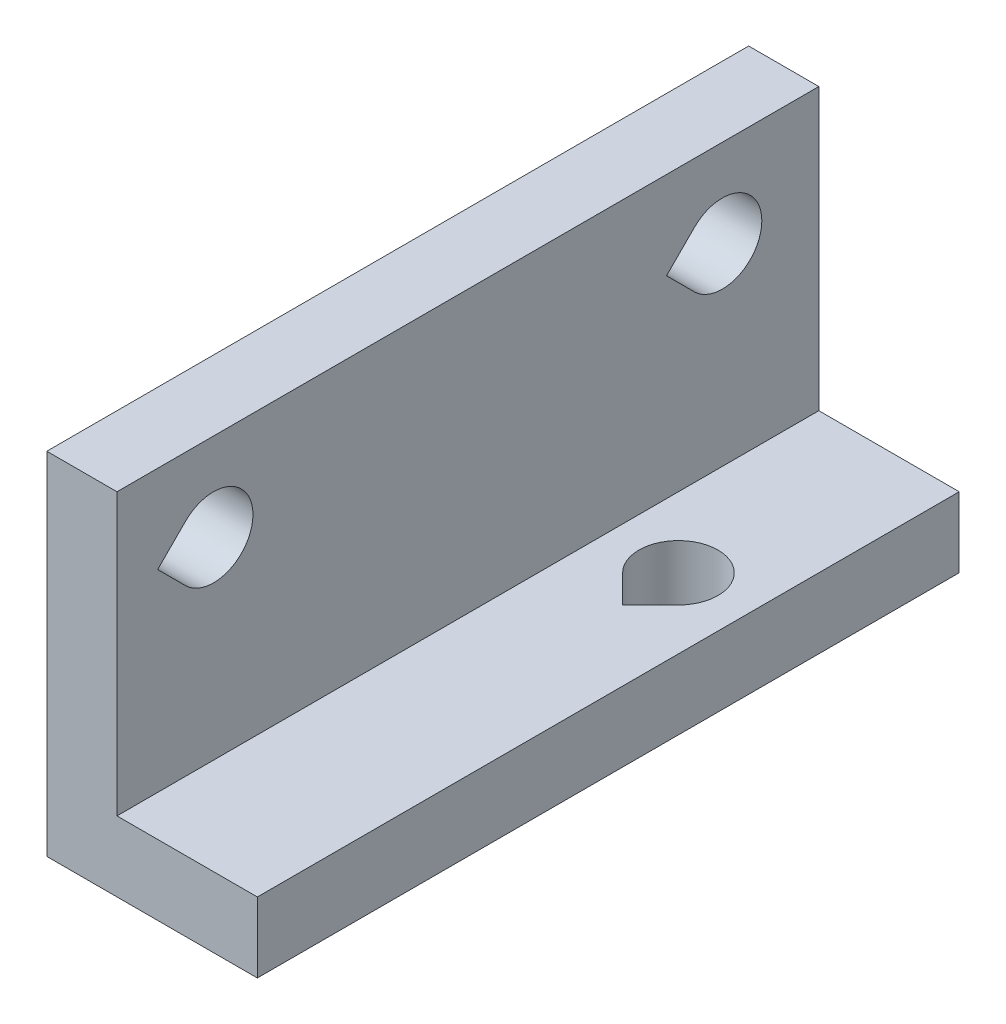
ISO-10303-21;
HEADER;
FILE_DESCRIPTION(('STEP AP214'),'2;1');
FILE_NAME('part.step','',(''),(''),'','','');
FILE_SCHEMA(('AUTOMOTIVE_DESIGN { 1 0 10303 214 1 1 1 1 }'));
ENDSEC;
DATA;
#1=APPLICATION_CONTEXT('core data for automotive mechanical design processes');
#2=APPLICATION_PROTOCOL_DEFINITION('international standard','automotive_design',2000,#1);
#3=PRODUCT_CONTEXT('',#1,'mechanical');
#4=PRODUCT('Part','Part','',(#3));
#5=PRODUCT_RELATED_PRODUCT_CATEGORY('part','',(#4));
#6=PRODUCT_DEFINITION_FORMATION('','',#4);
#7=PRODUCT_DEFINITION_CONTEXT('part definition',#1,'design');
#8=PRODUCT_DEFINITION('design','',#6,#7);
#9=PRODUCT_DEFINITION_SHAPE('','',#8);
#10=(LENGTH_UNIT() NAMED_UNIT(*) SI_UNIT(.MILLI.,.METRE.));
#11=(NAMED_UNIT(*) PLANE_ANGLE_UNIT() SI_UNIT($,.RADIAN.));
#12=(NAMED_UNIT(*) SI_UNIT($,.STERADIAN.) SOLID_ANGLE_UNIT());
#13=UNCERTAINTY_MEASURE_WITH_UNIT(LENGTH_MEASURE(1.E-05),#10,'distance_accuracy_value','');
#14=(GEOMETRIC_REPRESENTATION_CONTEXT(3) GLOBAL_UNCERTAINTY_ASSIGNED_CONTEXT((#13)) GLOBAL_UNIT_ASSIGNED_CONTEXT((#10,
#11,#12)) REPRESENTATION_CONTEXT('',''));
#15=CARTESIAN_POINT('',(0.,0.,0.));
#16=DIRECTION('',(0.,0.,1.));
#17=DIRECTION('',(1.,0.,0.));
#18=AXIS2_PLACEMENT_3D('',#15,#16,#17);
#19=CARTESIAN_POINT('',(9.40900974233027,0.,13.5909902576697));
#20=DIRECTION('',(-0.707106781186547,0.,0.707106781186548));
#21=DIRECTION('',(0.707106781186548,0.,0.707106781186547));
#22=AXIS2_PLACEMENT_3D('',#19,#20,#21);
#23=PLANE('',#22);
#24=DIRECTION('',(0.707106781186548,0.,0.707106781186547));
#25=VECTOR('',#24,1.);
#26=CARTESIAN_POINT('',(9.40900974233027,4.,13.5909902576697));
#27=LINE('',#26,#25);
#28=CARTESIAN_POINT('',(9.40900974233027,4.,13.5909902576697));
#29=VERTEX_POINT('',#28);
#30=CARTESIAN_POINT('',(11.,4.,15.1819805153395));
#31=VERTEX_POINT('',#30);
#32=EDGE_CURVE('E296',#29,#31,#27,.T.);
#33=ORIENTED_EDGE('',*,*,#32,.T.);
#34=DIRECTION('',(0.,1.,0.));
#35=VECTOR('',#34,1.);
#36=CARTESIAN_POINT('',(11.,0.,15.1819805153395));
#37=LINE('',#36,#35);
#38=CARTESIAN_POINT('',(11.,0.,15.1819805153395));
#39=VERTEX_POINT('',#38);
#40=EDGE_CURVE('E300',#39,#31,#37,.T.);
#41=ORIENTED_EDGE('',*,*,#40,.F.);
#42=DIRECTION('',(0.707106781186548,0.,0.707106781186547));
#43=VECTOR('',#42,1.);
#44=CARTESIAN_POINT('',(9.40900974233027,0.,13.5909902576697));
#45=LINE('',#44,#43);
#46=CARTESIAN_POINT('',(9.40900974233027,0.,13.5909902576697));
#47=VERTEX_POINT('',#46);
#48=EDGE_CURVE('E288',#47,#39,#45,.T.);
#49=ORIENTED_EDGE('',*,*,#48,.F.);
#50=DIRECTION('',(0.,1.,0.));
#51=VECTOR('',#50,1.);
#52=CARTESIAN_POINT('',(9.40900974233027,0.,13.5909902576697));
#53=LINE('',#52,#51);
#54=EDGE_CURVE('E168',#47,#29,#53,.T.);
#55=ORIENTED_EDGE('',*,*,#54,.T.);
#56=EDGE_LOOP('',(#33,#41,#49,#55));
#57=FACE_BOUND('',#56,.T.);
#58=ADVANCED_FACE('F32',(#57),#23,.F.);
#59=CARTESIAN_POINT('',(11.,0.,12.));
#60=DIRECTION('',(0.,1.,0.));
#61=DIRECTION('',(0.,0.,1.));
#62=AXIS2_PLACEMENT_3D('',#59,#60,#61);
#63=CYLINDRICAL_SURFACE('',#62,2.25);
#64=CARTESIAN_POINT('',(11.,4.,12.));
#65=DIRECTION('',(0.,1.,0.));
#66=DIRECTION('',(0.,0.,1.));
#67=AXIS2_PLACEMENT_3D('',#64,#65,#66);
#68=CIRCLE('',#67,2.25);
#69=CARTESIAN_POINT('',(12.5909902576697,4.,13.5909902576697));
#70=VERTEX_POINT('',#69);
#71=EDGE_CURVE('E284',#70,#29,#68,.T.);
#72=ORIENTED_EDGE('',*,*,#71,.T.);
#73=ORIENTED_EDGE('',*,*,#54,.F.);
#74=CARTESIAN_POINT('',(11.,0.,12.));
#75=DIRECTION('',(0.,1.,0.));
#76=DIRECTION('',(0.,0.,1.));
#77=AXIS2_PLACEMENT_3D('',#74,#75,#76);
#78=CIRCLE('',#77,2.25);
#79=CARTESIAN_POINT('',(12.5909902576697,0.,13.5909902576697));
#80=VERTEX_POINT('',#79);
#81=EDGE_CURVE('E285',#80,#47,#78,.T.);
#82=ORIENTED_EDGE('',*,*,#81,.F.);
#83=DIRECTION('',(0.,1.,0.));
#84=VECTOR('',#83,1.);
#85=CARTESIAN_POINT('',(12.5909902576697,0.,13.5909902576697));
#86=LINE('',#85,#84);
#87=EDGE_CURVE('E178',#80,#70,#86,.T.);
#88=ORIENTED_EDGE('',*,*,#87,.T.);
#89=EDGE_LOOP('',(#72,#73,#82,#88));
#90=FACE_BOUND('',#89,.T.);
#91=ADVANCED_FACE('F223',(#90),#63,.F.);
#92=CARTESIAN_POINT('',(11.,0.,15.1819805153395));
#93=DIRECTION('',(0.707106781186547,0.,0.707106781186548));
#94=DIRECTION('',(0.707106781186548,0.,-0.707106781186547));
#95=AXIS2_PLACEMENT_3D('',#92,#93,#94);
#96=PLANE('',#95);
#97=DIRECTION('',(0.707106781186548,0.,-0.707106781186547));
#98=VECTOR('',#97,1.);
#99=CARTESIAN_POINT('',(11.,4.,15.1819805153395));
#100=LINE('',#99,#98);
#101=EDGE_CURVE('E289',#31,#70,#100,.T.);
#102=ORIENTED_EDGE('',*,*,#101,.T.);
#103=ORIENTED_EDGE('',*,*,#87,.F.);
#104=DIRECTION('',(0.707106781186548,0.,-0.707106781186547));
#105=VECTOR('',#104,1.);
#106=CARTESIAN_POINT('',(11.,0.,15.1819805153395));
#107=LINE('',#106,#105);
#108=EDGE_CURVE('E292',#39,#80,#107,.T.);
#109=ORIENTED_EDGE('',*,*,#108,.F.);
#110=ORIENTED_EDGE('',*,*,#40,.T.);
#111=EDGE_LOOP('',(#102,#103,#109,#110));
#112=FACE_BOUND('',#111,.T.);
#113=ADVANCED_FACE('F229',(#112),#96,.F.);
#114=CARTESIAN_POINT('',(-15.,16.5909902576697,7.09099025766973));
#115=DIRECTION('',(0.,0.707106781186548,0.707106781186547));
#116=DIRECTION('',(0.,-0.707106781186547,0.707106781186548));
#117=AXIS2_PLACEMENT_3D('',#114,#115,#116);
#118=PLANE('',#117);
#119=DIRECTION('',(1.,0.,0.));
#120=VECTOR('',#119,1.);
#121=CARTESIAN_POINT('',(-15.,16.5909902576697,7.09099025766973));
#122=LINE('',#121,#120);
#123=CARTESIAN_POINT('',(3.,16.5909902576697,7.09099025766973));
#124=VERTEX_POINT('',#123);
#125=CARTESIAN_POINT('',(7.,16.5909902576697,7.09099025766974));
#126=VERTEX_POINT('',#125);
#127=EDGE_CURVE('E264',#124,#126,#122,.T.);
#128=ORIENTED_EDGE('',*,*,#127,.T.);
#129=DIRECTION('',(0.,-0.707106781186547,0.707106781186548));
#130=VECTOR('',#129,1.);
#131=CARTESIAN_POINT('',(7.,16.5909902576697,7.09099025766973));
#132=LINE('',#131,#130);
#133=CARTESIAN_POINT('',(7.,15.,8.68198051533946));
#134=VERTEX_POINT('',#133);
#135=EDGE_CURVE('E257',#126,#134,#132,.T.);
#136=ORIENTED_EDGE('',*,*,#135,.T.);
#137=DIRECTION('',(1.,0.,0.));
#138=VECTOR('',#137,1.);
#139=CARTESIAN_POINT('',(-15.,15.,8.68198051533946));
#140=LINE('',#139,#138);
#141=CARTESIAN_POINT('',(3.,15.,8.68198051533946));
#142=VERTEX_POINT('',#141);
#143=EDGE_CURVE('E273',#142,#134,#140,.T.);
#144=ORIENTED_EDGE('',*,*,#143,.F.);
#145=DIRECTION('',(0.,-0.707106781186547,0.707106781186548));
#146=VECTOR('',#145,1.);
#147=CARTESIAN_POINT('',(3.,1.84099025766973,21.8409902576698));
#148=LINE('',#147,#146);
#149=EDGE_CURVE('E272',#124,#142,#148,.T.);
#150=ORIENTED_EDGE('',*,*,#149,.F.);
#151=EDGE_LOOP('',(#128,#136,#144,#150));
#152=FACE_BOUND('',#151,.T.);
#153=ADVANCED_FACE('F354',(#152),#118,.F.);
#154=CARTESIAN_POINT('',(-15.,15.,5.5));
#155=DIRECTION('',(1.,0.,0.));
#156=DIRECTION('',(0.,1.,0.));
#157=AXIS2_PLACEMENT_3D('',#154,#155,#156);
#158=CYLINDRICAL_SURFACE('',#157,2.25);
#159=DIRECTION('',(1.,0.,0.));
#160=VECTOR('',#159,1.);
#161=CARTESIAN_POINT('',(-15.,13.4090097423303,7.09099025766973));
#162=LINE('',#161,#160);
#163=CARTESIAN_POINT('',(3.,13.4090097423303,7.09099025766973));
#164=VERTEX_POINT('',#163);
#165=CARTESIAN_POINT('',(7.,13.4090097423303,7.09099025766973));
#166=VERTEX_POINT('',#165);
#167=EDGE_CURVE('E270',#164,#166,#162,.T.);
#168=ORIENTED_EDGE('',*,*,#167,.T.);
#169=CARTESIAN_POINT('',(7.,15.,5.5));
#170=DIRECTION('',(1.,0.,0.));
#171=DIRECTION('',(0.,1.,0.));
#172=AXIS2_PLACEMENT_3D('',#169,#170,#171);
#173=CIRCLE('',#172,2.25);
#174=EDGE_CURVE('E258',#166,#126,#173,.T.);
#175=ORIENTED_EDGE('',*,*,#174,.T.);
#176=ORIENTED_EDGE('',*,*,#127,.F.);
#177=CARTESIAN_POINT('',(3.,15.,5.5));
#178=DIRECTION('',(1.,0.,0.));
#179=DIRECTION('',(0.,1.,0.));
#180=AXIS2_PLACEMENT_3D('',#177,#178,#179);
#181=CIRCLE('',#180,2.25);
#182=EDGE_CURVE('E281',#164,#124,#181,.T.);
#183=ORIENTED_EDGE('',*,*,#182,.F.);
#184=EDGE_LOOP('',(#168,#175,#176,#183));
#185=FACE_BOUND('',#184,.T.);
#186=ADVANCED_FACE('F368',(#185),#158,.F.);
#187=CARTESIAN_POINT('',(-15.,15.,8.68198051533946));
#188=DIRECTION('',(0.,-0.707106781186548,0.707106781186547));
#189=DIRECTION('',(0.,-0.707106781186547,-0.707106781186548));
#190=AXIS2_PLACEMENT_3D('',#187,#188,#189);
#191=PLANE('',#190);
#192=ORIENTED_EDGE('',*,*,#143,.T.);
#193=DIRECTION('',(0.,-0.707106781186547,-0.707106781186548));
#194=VECTOR('',#193,1.);
#195=CARTESIAN_POINT('',(7.,15.,8.68198051533946));
#196=LINE('',#195,#194);
#197=EDGE_CURVE('E260',#134,#166,#196,.T.);
#198=ORIENTED_EDGE('',*,*,#197,.T.);
#199=ORIENTED_EDGE('',*,*,#167,.F.);
#200=DIRECTION('',(0.,-0.707106781186547,-0.707106781186548));
#201=VECTOR('',#200,1.);
#202=CARTESIAN_POINT('',(3.,33.1590097423303,26.8409902576698));
#203=LINE('',#202,#201);
#204=EDGE_CURVE('E278',#142,#164,#203,.T.);
#205=ORIENTED_EDGE('',*,*,#204,.F.);
#206=EDGE_LOOP('',(#192,#198,#199,#205));
#207=FACE_BOUND('',#206,.T.);
#208=ADVANCED_FACE('F372',(#207),#191,.F.);
#209=CARTESIAN_POINT('',(-15.,16.5909902576697,36.0909902576697));
#210=DIRECTION('',(0.,0.707106781186548,0.707106781186547));
#211=DIRECTION('',(0.,-0.707106781186547,0.707106781186548));
#212=AXIS2_PLACEMENT_3D('',#209,#210,#211);
#213=PLANE('',#212);
#214=DIRECTION('',(1.,0.,0.));
#215=VECTOR('',#214,1.);
#216=CARTESIAN_POINT('',(-15.,16.5909902576697,36.0909902576697));
#217=LINE('',#216,#215);
#218=CARTESIAN_POINT('',(3.,16.5909902576697,36.0909902576697));
#219=VERTEX_POINT('',#218);
#220=CARTESIAN_POINT('',(7.,16.5909902576697,36.0909902576697));
#221=VERTEX_POINT('',#220);
#222=EDGE_CURVE('E422',#219,#221,#217,.T.);
#223=ORIENTED_EDGE('',*,*,#222,.T.);
#224=DIRECTION('',(0.,-0.707106781186547,0.707106781186548));
#225=VECTOR('',#224,1.);
#226=CARTESIAN_POINT('',(7.,16.5909902576697,36.0909902576697));
#227=LINE('',#226,#225);
#228=CARTESIAN_POINT('',(7.,15.,37.6819805153395));
#229=VERTEX_POINT('',#228);
#230=EDGE_CURVE('E252',#221,#229,#227,.T.);
#231=ORIENTED_EDGE('',*,*,#230,.T.);
#232=DIRECTION('',(1.,0.,0.));
#233=VECTOR('',#232,1.);
#234=CARTESIAN_POINT('',(-15.,15.,37.6819805153395));
#235=LINE('',#234,#233);
#236=CARTESIAN_POINT('',(3.,15.,37.6819805153395));
#237=VERTEX_POINT('',#236);
#238=EDGE_CURVE('E55',#237,#229,#235,.T.);
#239=ORIENTED_EDGE('',*,*,#238,.F.);
#240=DIRECTION('',(0.,-0.707106781186547,0.707106781186548));
#241=VECTOR('',#240,1.);
#242=CARTESIAN_POINT('',(3.,16.3409902576697,36.3409902576697));
#243=LINE('',#242,#241);
#244=EDGE_CURVE('E424',#219,#237,#243,.T.);
#245=ORIENTED_EDGE('',*,*,#244,.F.);
#246=EDGE_LOOP('',(#223,#231,#239,#245));
#247=FACE_BOUND('',#246,.T.);
#248=ADVANCED_FACE('F381',(#247),#213,.F.);
#249=CARTESIAN_POINT('',(-15.,15.,34.5));
#250=DIRECTION('',(1.,0.,0.));
#251=DIRECTION('',(0.,1.,0.));
#252=AXIS2_PLACEMENT_3D('',#249,#250,#251);
#253=CYLINDRICAL_SURFACE('',#252,2.25);
#254=DIRECTION('',(1.,0.,0.));
#255=VECTOR('',#254,1.);
#256=CARTESIAN_POINT('',(-15.,13.4090097423303,36.0909902576697));
#257=LINE('',#256,#255);
#258=CARTESIAN_POINT('',(3.,13.4090097423303,36.0909902576697));
#259=VERTEX_POINT('',#258);
#260=CARTESIAN_POINT('',(7.,13.4090097423303,36.0909902576697));
#261=VERTEX_POINT('',#260);
#262=EDGE_CURVE('E428',#259,#261,#257,.T.);
#263=ORIENTED_EDGE('',*,*,#262,.T.);
#264=CARTESIAN_POINT('',(7.,15.,34.5));
#265=DIRECTION('',(1.,0.,0.));
#266=DIRECTION('',(0.,1.,0.));
#267=AXIS2_PLACEMENT_3D('',#264,#265,#266);
#268=CIRCLE('',#267,2.25);
#269=EDGE_CURVE('E47',#261,#221,#268,.T.);
#270=ORIENTED_EDGE('',*,*,#269,.T.);
#271=ORIENTED_EDGE('',*,*,#222,.F.);
#272=CARTESIAN_POINT('',(3.,15.,34.5));
#273=DIRECTION('',(1.,0.,0.));
#274=DIRECTION('',(0.,1.,0.));
#275=AXIS2_PLACEMENT_3D('',#272,#273,#274);
#276=CIRCLE('',#275,2.25);
#277=EDGE_CURVE('E266',#259,#219,#276,.T.);
#278=ORIENTED_EDGE('',*,*,#277,.F.);
#279=EDGE_LOOP('',(#263,#270,#271,#278));
#280=FACE_BOUND('',#279,.T.);
#281=ADVANCED_FACE('F219',(#280),#253,.F.);
#282=CARTESIAN_POINT('',(-15.,15.,37.6819805153395));
#283=DIRECTION('',(0.,-0.707106781186548,0.707106781186547));
#284=DIRECTION('',(0.,-0.707106781186547,-0.707106781186548));
#285=AXIS2_PLACEMENT_3D('',#282,#283,#284);
#286=PLANE('',#285);
#287=ORIENTED_EDGE('',*,*,#238,.T.);
#288=DIRECTION('',(0.,-0.707106781186547,-0.707106781186548));
#289=VECTOR('',#288,1.);
#290=CARTESIAN_POINT('',(7.,15.,37.6819805153395));
#291=LINE('',#290,#289);
#292=EDGE_CURVE('E426',#229,#261,#291,.T.);
#293=ORIENTED_EDGE('',*,*,#292,.T.);
#294=ORIENTED_EDGE('',*,*,#262,.F.);
#295=DIRECTION('',(0.,-0.707106781186547,-0.707106781186548));
#296=VECTOR('',#295,1.);
#297=CARTESIAN_POINT('',(3.,18.6590097423303,41.3409902576697));
#298=LINE('',#297,#296);
#299=EDGE_CURVE('E435',#237,#259,#298,.T.);
#300=ORIENTED_EDGE('',*,*,#299,.F.);
#301=EDGE_LOOP('',(#287,#293,#294,#300));
#302=FACE_BOUND('',#301,.T.);
#303=ADVANCED_FACE('F212',(#302),#286,.F.);
#304=CARTESIAN_POINT('',(15.,0.,40.));
#305=DIRECTION('',(-1.,0.,0.));
#306=DIRECTION('',(0.,0.,1.));
#307=AXIS2_PLACEMENT_3D('',#304,#305,#306);
#308=PLANE('',#307);
#309=DIRECTION('',(0.,1.,0.));
#310=VECTOR('',#309,1.);
#311=CARTESIAN_POINT('',(15.,0.,0.));
#312=LINE('',#311,#310);
#313=CARTESIAN_POINT('',(15.,0.,0.));
#314=VERTEX_POINT('',#313);
#315=CARTESIAN_POINT('',(15.,4.,0.));
#316=VERTEX_POINT('',#315);
#317=EDGE_CURVE('E177',#314,#316,#312,.T.);
#318=ORIENTED_EDGE('',*,*,#317,.T.);
#319=DIRECTION('',(0.,0.,-1.));
#320=VECTOR('',#319,1.);
#321=CARTESIAN_POINT('',(15.,4.,40.));
#322=LINE('',#321,#320);
#323=CARTESIAN_POINT('',(15.,4.,40.));
#324=VERTEX_POINT('',#323);
#325=EDGE_CURVE('E40',#324,#316,#322,.T.);
#326=ORIENTED_EDGE('',*,*,#325,.F.);
#327=DIRECTION('',(0.,1.,0.));
#328=VECTOR('',#327,1.);
#329=CARTESIAN_POINT('',(15.,0.,40.));
#330=LINE('',#329,#328);
#331=CARTESIAN_POINT('',(15.,0.,40.));
#332=VERTEX_POINT('',#331);
#333=EDGE_CURVE('E161',#332,#324,#330,.T.);
#334=ORIENTED_EDGE('',*,*,#333,.F.);
#335=DIRECTION('',(0.,0.,-1.));
#336=VECTOR('',#335,1.);
#337=CARTESIAN_POINT('',(15.,0.,40.));
#338=LINE('',#337,#336);
#339=EDGE_CURVE('E11',#332,#314,#338,.T.);
#340=ORIENTED_EDGE('',*,*,#339,.T.);
#341=EDGE_LOOP('',(#318,#326,#334,#340));
#342=FACE_BOUND('',#341,.T.);
#343=ADVANCED_FACE('F210',(#342),#308,.F.);
#344=CARTESIAN_POINT('',(15.,4.,40.));
#345=DIRECTION('',(0.,-1.,0.));
#346=DIRECTION('',(0.,0.,-1.));
#347=AXIS2_PLACEMENT_3D('',#344,#345,#346);
#348=PLANE('',#347);
#349=ORIENTED_EDGE('',*,*,#32,.F.);
#350=ORIENTED_EDGE('',*,*,#71,.F.);
#351=ORIENTED_EDGE('',*,*,#101,.F.);
#352=EDGE_LOOP('',(#349,#350,#351));
#353=FACE_BOUND('',#352,.T.);
#354=DIRECTION('',(-1.,0.,0.));
#355=VECTOR('',#354,1.);
#356=CARTESIAN_POINT('',(15.,4.,0.));
#357=LINE('',#356,#355);
#358=CARTESIAN_POINT('',(7.,4.,0.));
#359=VERTEX_POINT('',#358);
#360=EDGE_CURVE('E180',#316,#359,#357,.T.);
#361=ORIENTED_EDGE('',*,*,#360,.T.);
#362=DIRECTION('',(0.,0.,-1.));
#363=VECTOR('',#362,1.);
#364=CARTESIAN_POINT('',(7.,4.,40.));
#365=LINE('',#364,#363);
#366=CARTESIAN_POINT('',(7.,4.,40.));
#367=VERTEX_POINT('',#366);
#368=EDGE_CURVE('E189',#367,#359,#365,.T.);
#369=ORIENTED_EDGE('',*,*,#368,.F.);
#370=DIRECTION('',(-1.,0.,0.));
#371=VECTOR('',#370,1.);
#372=CARTESIAN_POINT('',(15.,4.,40.));
#373=LINE('',#372,#371);
#374=EDGE_CURVE('E163',#324,#367,#373,.T.);
#375=ORIENTED_EDGE('',*,*,#374,.F.);
#376=ORIENTED_EDGE('',*,*,#325,.T.);
#377=EDGE_LOOP('',(#361,#369,#375,#376));
#378=FACE_BOUND('',#377,.T.);
#379=ADVANCED_FACE('F196',(#353,#378),#348,.F.);
#380=CARTESIAN_POINT('',(7.,4.,40.));
#381=DIRECTION('',(-1.,0.,0.));
#382=DIRECTION('',(0.,-1.,0.));
#383=AXIS2_PLACEMENT_3D('',#380,#381,#382);
#384=PLANE('',#383);
#385=ORIENTED_EDGE('',*,*,#230,.F.);
#386=ORIENTED_EDGE('',*,*,#269,.F.);
#387=ORIENTED_EDGE('',*,*,#292,.F.);
#388=EDGE_LOOP('',(#385,#386,#387));
#389=FACE_BOUND('',#388,.T.);
#390=ORIENTED_EDGE('',*,*,#135,.F.);
#391=ORIENTED_EDGE('',*,*,#174,.F.);
#392=ORIENTED_EDGE('',*,*,#197,.F.);
#393=EDGE_LOOP('',(#390,#391,#392));
#394=FACE_BOUND('',#393,.T.);
#395=DIRECTION('',(0.,1.,0.));
#396=VECTOR('',#395,1.);
#397=CARTESIAN_POINT('',(7.,4.,0.));
#398=LINE('',#397,#396);
#399=CARTESIAN_POINT('',(7.,20.,0.));
#400=VERTEX_POINT('',#399);
#401=EDGE_CURVE('E182',#359,#400,#398,.T.);
#402=ORIENTED_EDGE('',*,*,#401,.T.);
#403=DIRECTION('',(0.,0.,-1.));
#404=VECTOR('',#403,1.);
#405=CARTESIAN_POINT('',(7.,20.,40.));
#406=LINE('',#405,#404);
#407=CARTESIAN_POINT('',(7.,20.,40.));
#408=VERTEX_POINT('',#407);
#409=EDGE_CURVE('E186',#408,#400,#406,.T.);
#410=ORIENTED_EDGE('',*,*,#409,.F.);
#411=DIRECTION('',(0.,1.,0.));
#412=VECTOR('',#411,1.);
#413=CARTESIAN_POINT('',(7.,4.,40.));
#414=LINE('',#413,#412);
#415=EDGE_CURVE('E172',#367,#408,#414,.T.);
#416=ORIENTED_EDGE('',*,*,#415,.F.);
#417=ORIENTED_EDGE('',*,*,#368,.T.);
#418=EDGE_LOOP('',(#402,#410,#416,#417));
#419=FACE_BOUND('',#418,.T.);
#420=ADVANCED_FACE('F206',(#389,#394,#419),#384,.F.);
#421=CARTESIAN_POINT('',(7.,20.,40.));
#422=DIRECTION('',(0.,-1.,0.));
#423=DIRECTION('',(0.,0.,-1.));
#424=AXIS2_PLACEMENT_3D('',#421,#422,#423);
#425=PLANE('',#424);
#426=DIRECTION('',(-1.,0.,0.));
#427=VECTOR('',#426,1.);
#428=CARTESIAN_POINT('',(7.,20.,0.));
#429=LINE('',#428,#427);
#430=CARTESIAN_POINT('',(3.,20.,0.));
#431=VERTEX_POINT('',#430);
#432=EDGE_CURVE('E165',#400,#431,#429,.T.);
#433=ORIENTED_EDGE('',*,*,#432,.T.);
#434=DIRECTION('',(0.,0.,-1.));
#435=VECTOR('',#434,1.);
#436=CARTESIAN_POINT('',(3.,20.,40.));
#437=LINE('',#436,#435);
#438=CARTESIAN_POINT('',(3.,20.,40.));
#439=VERTEX_POINT('',#438);
#440=EDGE_CURVE('E150',#439,#431,#437,.T.);
#441=ORIENTED_EDGE('',*,*,#440,.F.);
#442=DIRECTION('',(-1.,0.,0.));
#443=VECTOR('',#442,1.);
#444=CARTESIAN_POINT('',(7.,20.,40.));
#445=LINE('',#444,#443);
#446=EDGE_CURVE('E146',#408,#439,#445,.T.);
#447=ORIENTED_EDGE('',*,*,#446,.F.);
#448=ORIENTED_EDGE('',*,*,#409,.T.);
#449=EDGE_LOOP('',(#433,#441,#447,#448));
#450=FACE_BOUND('',#449,.T.);
#451=ADVANCED_FACE('F209',(#450),#425,.F.);
#452=CARTESIAN_POINT('',(0.,0.,40.));
#453=DIRECTION('',(0.,0.,1.));
#454=DIRECTION('',(1.,0.,0.));
#455=AXIS2_PLACEMENT_3D('',#452,#453,#454);
#456=PLANE('',#455);
#457=DIRECTION('',(0.,-1.,0.));
#458=VECTOR('',#457,1.);
#459=CARTESIAN_POINT('',(3.,20.,40.));
#460=LINE('',#459,#458);
#461=CARTESIAN_POINT('',(3.,0.,40.));
#462=VERTEX_POINT('',#461);
#463=EDGE_CURVE('E139',#439,#462,#460,.T.);
#464=ORIENTED_EDGE('',*,*,#463,.T.);
#465=DIRECTION('',(1.,0.,0.));
#466=VECTOR('',#465,1.);
#467=CARTESIAN_POINT('',(-15.,0.,40.));
#468=LINE('',#467,#466);
#469=EDGE_CURVE('E143',#462,#332,#468,.T.);
#470=ORIENTED_EDGE('',*,*,#469,.T.);
#471=ORIENTED_EDGE('',*,*,#333,.T.);
#472=ORIENTED_EDGE('',*,*,#374,.T.);
#473=ORIENTED_EDGE('',*,*,#415,.T.);
#474=ORIENTED_EDGE('',*,*,#446,.T.);
#475=EDGE_LOOP('',(#464,#470,#471,#472,#473,#474));
#476=FACE_BOUND('',#475,.T.);
#477=ADVANCED_FACE('F141',(#476),#456,.T.);
#478=CARTESIAN_POINT('',(0.,0.,0.));
#479=DIRECTION('',(0.,0.,1.));
#480=DIRECTION('',(1.,0.,0.));
#481=AXIS2_PLACEMENT_3D('',#478,#479,#480);
#482=PLANE('',#481);
#483=DIRECTION('',(1.,0.,0.));
#484=VECTOR('',#483,1.);
#485=CARTESIAN_POINT('',(-15.,0.,0.));
#486=LINE('',#485,#484);
#487=CARTESIAN_POINT('',(3.,0.,0.));
#488=VERTEX_POINT('',#487);
#489=EDGE_CURVE('E175',#488,#314,#486,.T.);
#490=ORIENTED_EDGE('',*,*,#489,.F.);
#491=DIRECTION('',(0.,-1.,0.));
#492=VECTOR('',#491,1.);
#493=CARTESIAN_POINT('',(3.,20.,0.));
#494=LINE('',#493,#492);
#495=EDGE_CURVE('E156',#431,#488,#494,.T.);
#496=ORIENTED_EDGE('',*,*,#495,.F.);
#497=ORIENTED_EDGE('',*,*,#432,.F.);
#498=ORIENTED_EDGE('',*,*,#401,.F.);
#499=ORIENTED_EDGE('',*,*,#360,.F.);
#500=ORIENTED_EDGE('',*,*,#317,.F.);
#501=EDGE_LOOP('',(#490,#496,#497,#498,#499,#500));
#502=FACE_BOUND('',#501,.T.);
#503=ADVANCED_FACE('F202',(#502),#482,.F.);
#504=CARTESIAN_POINT('',(3.,20.,40.));
#505=DIRECTION('',(1.,0.,0.));
#506=DIRECTION('',(0.,1.,0.));
#507=AXIS2_PLACEMENT_3D('',#504,#505,#506);
#508=PLANE('',#507);
#509=ORIENTED_EDGE('',*,*,#299,.T.);
#510=ORIENTED_EDGE('',*,*,#277,.T.);
#511=ORIENTED_EDGE('',*,*,#244,.T.);
#512=EDGE_LOOP('',(#509,#510,#511));
#513=FACE_BOUND('',#512,.T.);
#514=ORIENTED_EDGE('',*,*,#204,.T.);
#515=ORIENTED_EDGE('',*,*,#182,.T.);
#516=ORIENTED_EDGE('',*,*,#149,.T.);
#517=EDGE_LOOP('',(#514,#515,#516));
#518=FACE_BOUND('',#517,.T.);
#519=ORIENTED_EDGE('',*,*,#495,.T.);
#520=DIRECTION('',(0.,0.,-1.));
#521=VECTOR('',#520,1.);
#522=CARTESIAN_POINT('',(3.,0.,0.));
#523=LINE('',#522,#521);
#524=EDGE_CURVE('E153',#462,#488,#523,.T.);
#525=ORIENTED_EDGE('',*,*,#524,.F.);
#526=ORIENTED_EDGE('',*,*,#463,.F.);
#527=ORIENTED_EDGE('',*,*,#440,.T.);
#528=EDGE_LOOP('',(#519,#525,#526,#527));
#529=FACE_BOUND('',#528,.T.);
#530=ADVANCED_FACE('F154',(#513,#518,#529),#508,.F.);
#531=CARTESIAN_POINT('',(-15.,0.,40.));
#532=DIRECTION('',(0.,1.,0.));
#533=DIRECTION('',(0.,0.,1.));
#534=AXIS2_PLACEMENT_3D('',#531,#532,#533);
#535=PLANE('',#534);
#536=ORIENTED_EDGE('',*,*,#108,.T.);
#537=ORIENTED_EDGE('',*,*,#81,.T.);
#538=ORIENTED_EDGE('',*,*,#48,.T.);
#539=EDGE_LOOP('',(#536,#537,#538));
#540=FACE_BOUND('',#539,.T.);
#541=ORIENTED_EDGE('',*,*,#469,.F.);
#542=ORIENTED_EDGE('',*,*,#524,.T.);
#543=ORIENTED_EDGE('',*,*,#489,.T.);
#544=ORIENTED_EDGE('',*,*,#339,.F.);
#545=EDGE_LOOP('',(#541,#542,#543,#544));
#546=FACE_BOUND('',#545,.T.);
#547=ADVANCED_FACE('F34',(#540,#546),#535,.F.);
#548=CLOSED_SHELL('',(#58,#91,#113,#153,#186,#208,#248,#281,#303,#343,#379,#420,#451,#477,#503,
#530,#547));
#549=MANIFOLD_SOLID_BREP('B2',#548);
#550=ADVANCED_BREP_SHAPE_REPRESENTATION('',(#18,#549),#14);
#551=SHAPE_DEFINITION_REPRESENTATION(#9,#550);
ENDSEC;
END-ISO-10303-21;
